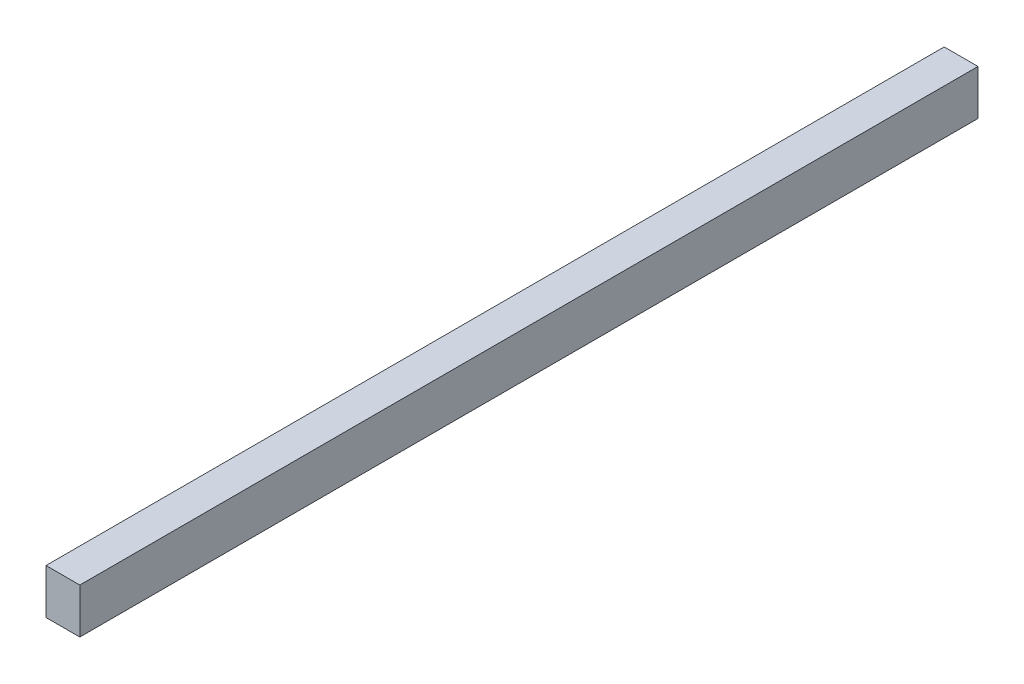
ISO-10303-21;
HEADER;
FILE_DESCRIPTION(('STEP AP214'),'2;1');
FILE_NAME('part.step','',(''),(''),'','','');
FILE_SCHEMA(('AUTOMOTIVE_DESIGN { 1 0 10303 214 1 1 1 1 }'));
ENDSEC;
DATA;
#1=APPLICATION_CONTEXT('core data for automotive mechanical design processes');
#2=APPLICATION_PROTOCOL_DEFINITION('international standard','automotive_design',2000,#1);
#3=PRODUCT_CONTEXT('',#1,'mechanical');
#4=PRODUCT('Part','Part','',(#3));
#5=PRODUCT_RELATED_PRODUCT_CATEGORY('part','',(#4));
#6=PRODUCT_DEFINITION_FORMATION('','',#4);
#7=PRODUCT_DEFINITION_CONTEXT('part definition',#1,'design');
#8=PRODUCT_DEFINITION('design','',#6,#7);
#9=PRODUCT_DEFINITION_SHAPE('','',#8);
#10=(LENGTH_UNIT() NAMED_UNIT(*) SI_UNIT(.MILLI.,.METRE.));
#11=(NAMED_UNIT(*) PLANE_ANGLE_UNIT() SI_UNIT($,.RADIAN.));
#12=(NAMED_UNIT(*) SI_UNIT($,.STERADIAN.) SOLID_ANGLE_UNIT());
#13=UNCERTAINTY_MEASURE_WITH_UNIT(LENGTH_MEASURE(1.E-05),#10,'distance_accuracy_value','');
#14=(GEOMETRIC_REPRESENTATION_CONTEXT(3) GLOBAL_UNCERTAINTY_ASSIGNED_CONTEXT((#13)) GLOBAL_UNIT_ASSIGNED_CONTEXT((#10,
#11,#12)) REPRESENTATION_CONTEXT('',''));
#15=CARTESIAN_POINT('',(0.,0.,0.));
#16=DIRECTION('',(0.,0.,1.));
#17=DIRECTION('',(1.,0.,0.));
#18=AXIS2_PLACEMENT_3D('',#15,#16,#17);
#19=CARTESIAN_POINT('',(-13.3027017279867,40.,797.));
#20=DIRECTION('',(0.,-1.,0.));
#21=DIRECTION('',(0.,0.,-1.));
#22=AXIS2_PLACEMENT_3D('',#19,#20,#21);
#23=PLANE('',#22);
#24=DIRECTION('',(-1.,0.,0.));
#25=VECTOR('',#24,1.);
#26=CARTESIAN_POINT('',(-13.3027017279867,40.,0.));
#27=LINE('',#26,#25);
#28=CARTESIAN_POINT('',(-13.3027017279867,40.,0.));
#29=VERTEX_POINT('',#28);
#30=CARTESIAN_POINT('',(-43.3027017279867,40.,0.));
#31=VERTEX_POINT('',#30);
#32=EDGE_CURVE('E95',#29,#31,#27,.T.);
#33=ORIENTED_EDGE('',*,*,#32,.T.);
#34=DIRECTION('',(0.,0.,-1.));
#35=VECTOR('',#34,1.);
#36=CARTESIAN_POINT('',(-43.3027017279867,40.,797.));
#37=LINE('',#36,#35);
#38=CARTESIAN_POINT('',(-43.3027017279867,40.,797.));
#39=VERTEX_POINT('',#38);
#40=EDGE_CURVE('E11',#39,#31,#37,.T.);
#41=ORIENTED_EDGE('',*,*,#40,.F.);
#42=DIRECTION('',(-1.,0.,0.));
#43=VECTOR('',#42,1.);
#44=CARTESIAN_POINT('',(-13.3027017279867,40.,797.));
#45=LINE('',#44,#43);
#46=CARTESIAN_POINT('',(-13.3027017279867,40.,797.));
#47=VERTEX_POINT('',#46);
#48=EDGE_CURVE('E83',#47,#39,#45,.T.);
#49=ORIENTED_EDGE('',*,*,#48,.F.);
#50=DIRECTION('',(0.,0.,-1.));
#51=VECTOR('',#50,1.);
#52=CARTESIAN_POINT('',(-13.3027017279867,40.,797.));
#53=LINE('',#52,#51);
#54=EDGE_CURVE('E91',#47,#29,#53,.T.);
#55=ORIENTED_EDGE('',*,*,#54,.T.);
#56=EDGE_LOOP('',(#33,#41,#49,#55));
#57=FACE_BOUND('',#56,.T.);
#58=ADVANCED_FACE('F32',(#57),#23,.F.);
#59=CARTESIAN_POINT('',(-43.3027017279867,40.,797.));
#60=DIRECTION('',(1.,0.,0.));
#61=DIRECTION('',(0.,0.,-1.));
#62=AXIS2_PLACEMENT_3D('',#59,#60,#61);
#63=PLANE('',#62);
#64=DIRECTION('',(0.,-1.,0.));
#65=VECTOR('',#64,1.);
#66=CARTESIAN_POINT('',(-43.3027017279867,40.,0.));
#67=LINE('',#66,#65);
#68=CARTESIAN_POINT('',(-43.3027017279867,0.,0.));
#69=VERTEX_POINT('',#68);
#70=EDGE_CURVE('E87',#31,#69,#67,.T.);
#71=ORIENTED_EDGE('',*,*,#70,.T.);
#72=DIRECTION('',(0.,0.,-1.));
#73=VECTOR('',#72,1.);
#74=CARTESIAN_POINT('',(-43.3027017279867,0.,797.));
#75=LINE('',#74,#73);
#76=CARTESIAN_POINT('',(-43.3027017279867,0.,797.));
#77=VERTEX_POINT('',#76);
#78=EDGE_CURVE('E40',#77,#69,#75,.T.);
#79=ORIENTED_EDGE('',*,*,#78,.F.);
#80=DIRECTION('',(0.,-1.,0.));
#81=VECTOR('',#80,1.);
#82=CARTESIAN_POINT('',(-43.3027017279867,40.,797.));
#83=LINE('',#82,#81);
#84=EDGE_CURVE('E78',#39,#77,#83,.T.);
#85=ORIENTED_EDGE('',*,*,#84,.F.);
#86=ORIENTED_EDGE('',*,*,#40,.T.);
#87=EDGE_LOOP('',(#71,#79,#85,#86));
#88=FACE_BOUND('',#87,.T.);
#89=ADVANCED_FACE('F86',(#88),#63,.F.);
#90=CARTESIAN_POINT('',(-43.3027017279867,0.,797.));
#91=DIRECTION('',(0.,1.,0.));
#92=DIRECTION('',(0.,0.,1.));
#93=AXIS2_PLACEMENT_3D('',#90,#91,#92);
#94=PLANE('',#93);
#95=DIRECTION('',(1.,0.,0.));
#96=VECTOR('',#95,1.);
#97=CARTESIAN_POINT('',(-43.3027017279867,0.,0.));
#98=LINE('',#97,#96);
#99=CARTESIAN_POINT('',(-13.3027017279867,0.,0.));
#100=VERTEX_POINT('',#99);
#101=EDGE_CURVE('E65',#69,#100,#98,.T.);
#102=ORIENTED_EDGE('',*,*,#101,.T.);
#103=DIRECTION('',(0.,0.,-1.));
#104=VECTOR('',#103,1.);
#105=CARTESIAN_POINT('',(-13.3027017279867,0.,797.));
#106=LINE('',#105,#104);
#107=CARTESIAN_POINT('',(-13.3027017279867,0.,797.));
#108=VERTEX_POINT('',#107);
#109=EDGE_CURVE('E88',#108,#100,#106,.T.);
#110=ORIENTED_EDGE('',*,*,#109,.F.);
#111=DIRECTION('',(1.,0.,0.));
#112=VECTOR('',#111,1.);
#113=CARTESIAN_POINT('',(-43.3027017279867,0.,797.));
#114=LINE('',#113,#112);
#115=EDGE_CURVE('E81',#77,#108,#114,.T.);
#116=ORIENTED_EDGE('',*,*,#115,.F.);
#117=ORIENTED_EDGE('',*,*,#78,.T.);
#118=EDGE_LOOP('',(#102,#110,#116,#117));
#119=FACE_BOUND('',#118,.T.);
#120=ADVANCED_FACE('F89',(#119),#94,.F.);
#121=CARTESIAN_POINT('',(-13.3027017279867,0.,797.));
#122=DIRECTION('',(-1.,0.,0.));
#123=DIRECTION('',(0.,0.,1.));
#124=AXIS2_PLACEMENT_3D('',#121,#122,#123);
#125=PLANE('',#124);
#126=DIRECTION('',(0.,1.,0.));
#127=VECTOR('',#126,1.);
#128=CARTESIAN_POINT('',(-13.3027017279867,0.,0.));
#129=LINE('',#128,#127);
#130=EDGE_CURVE('E71',#100,#29,#129,.T.);
#131=ORIENTED_EDGE('',*,*,#130,.T.);
#132=ORIENTED_EDGE('',*,*,#54,.F.);
#133=DIRECTION('',(0.,1.,0.));
#134=VECTOR('',#133,1.);
#135=CARTESIAN_POINT('',(-13.3027017279867,0.,797.));
#136=LINE('',#135,#134);
#137=EDGE_CURVE('E48',#108,#47,#136,.T.);
#138=ORIENTED_EDGE('',*,*,#137,.F.);
#139=ORIENTED_EDGE('',*,*,#109,.T.);
#140=EDGE_LOOP('',(#131,#132,#138,#139));
#141=FACE_BOUND('',#140,.T.);
#142=ADVANCED_FACE('F102',(#141),#125,.F.);
#143=CARTESIAN_POINT('',(0.,0.,797.));
#144=DIRECTION('',(0.,0.,1.));
#145=DIRECTION('',(1.,0.,0.));
#146=AXIS2_PLACEMENT_3D('',#143,#144,#145);
#147=PLANE('',#146);
#148=ORIENTED_EDGE('',*,*,#48,.T.);
#149=ORIENTED_EDGE('',*,*,#84,.T.);
#150=ORIENTED_EDGE('',*,*,#115,.T.);
#151=ORIENTED_EDGE('',*,*,#137,.T.);
#152=EDGE_LOOP('',(#148,#149,#150,#151));
#153=FACE_BOUND('',#152,.T.);
#154=ADVANCED_FACE('F79',(#153),#147,.T.);
#155=CARTESIAN_POINT('',(0.,0.,0.));
#156=DIRECTION('',(0.,0.,1.));
#157=DIRECTION('',(1.,0.,0.));
#158=AXIS2_PLACEMENT_3D('',#155,#156,#157);
#159=PLANE('',#158);
#160=ORIENTED_EDGE('',*,*,#32,.F.);
#161=ORIENTED_EDGE('',*,*,#130,.F.);
#162=ORIENTED_EDGE('',*,*,#101,.F.);
#163=ORIENTED_EDGE('',*,*,#70,.F.);
#164=EDGE_LOOP('',(#160,#161,#162,#163));
#165=FACE_BOUND('',#164,.T.);
#166=ADVANCED_FACE('F105',(#165),#159,.F.);
#167=CLOSED_SHELL('',(#58,#89,#120,#142,#154,#166));
#168=MANIFOLD_SOLID_BREP('B2',#167);
#169=ADVANCED_BREP_SHAPE_REPRESENTATION('',(#18,#168),#14);
#170=SHAPE_DEFINITION_REPRESENTATION(#9,#169);
ENDSEC;
END-ISO-10303-21;
